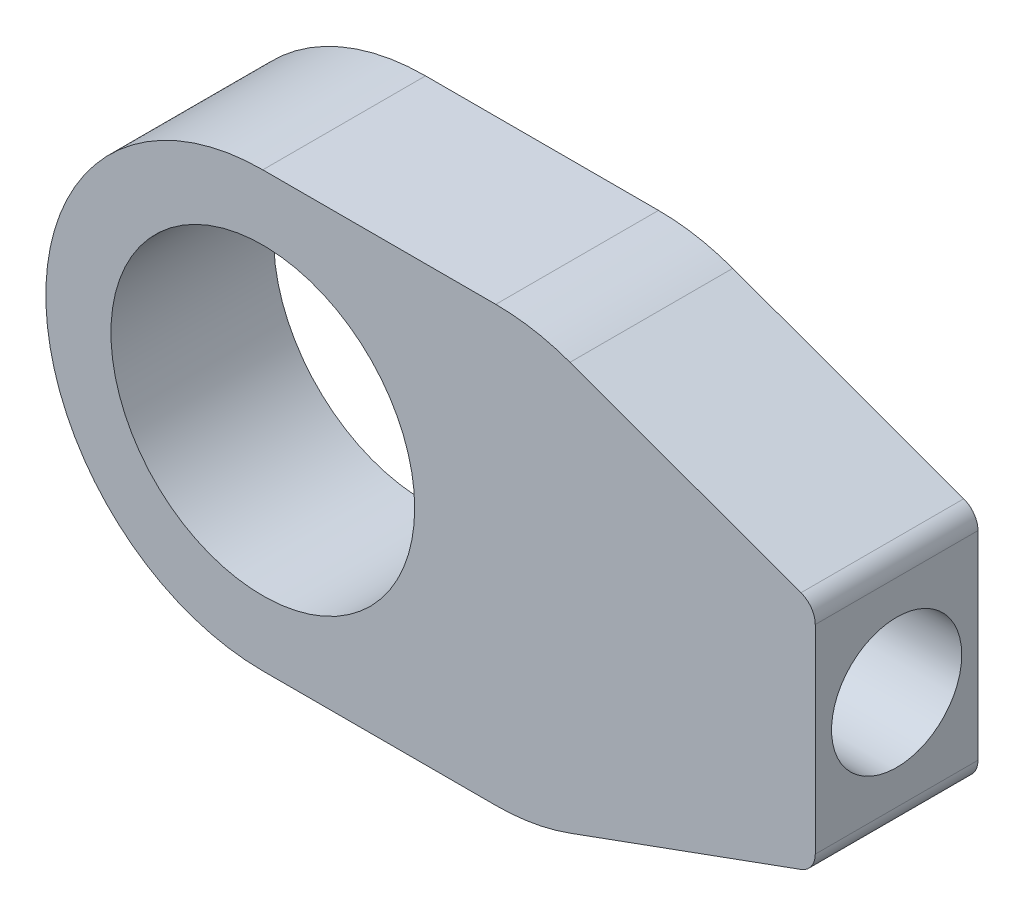
ISO-10303-21;
HEADER;
FILE_DESCRIPTION(('STEP AP214'),'2;1');
FILE_NAME('part.step','',(''),(''),'','','');
FILE_SCHEMA(('AUTOMOTIVE_DESIGN { 1 0 10303 214 1 1 1 1 }'));
ENDSEC;
DATA;
#1=APPLICATION_CONTEXT('core data for automotive mechanical design processes');
#2=APPLICATION_PROTOCOL_DEFINITION('international standard','automotive_design',2000,#1);
#3=PRODUCT_CONTEXT('',#1,'mechanical');
#4=PRODUCT('Part','Part','',(#3));
#5=PRODUCT_RELATED_PRODUCT_CATEGORY('part','',(#4));
#6=PRODUCT_DEFINITION_FORMATION('','',#4);
#7=PRODUCT_DEFINITION_CONTEXT('part definition',#1,'design');
#8=PRODUCT_DEFINITION('design','',#6,#7);
#9=PRODUCT_DEFINITION_SHAPE('','',#8);
#10=(LENGTH_UNIT() NAMED_UNIT(*) SI_UNIT(.MILLI.,.METRE.));
#11=(NAMED_UNIT(*) PLANE_ANGLE_UNIT() SI_UNIT($,.RADIAN.));
#12=(NAMED_UNIT(*) SI_UNIT($,.STERADIAN.) SOLID_ANGLE_UNIT());
#13=UNCERTAINTY_MEASURE_WITH_UNIT(LENGTH_MEASURE(1.E-05),#10,'distance_accuracy_value','');
#14=(GEOMETRIC_REPRESENTATION_CONTEXT(3) GLOBAL_UNCERTAINTY_ASSIGNED_CONTEXT((#13)) GLOBAL_UNIT_ASSIGNED_CONTEXT((#10,
#11,#12)) REPRESENTATION_CONTEXT('',''));
#15=CARTESIAN_POINT('',(0.,0.,0.));
#16=DIRECTION('',(0.,0.,1.));
#17=DIRECTION('',(1.,0.,0.));
#18=AXIS2_PLACEMENT_3D('',#15,#16,#17);
#19=CARTESIAN_POINT('',(24.4604511048396,-4.58257403696616,7.5));
#20=DIRECTION('',(0.,0.,1.));
#21=DIRECTION('',(1.,0.,0.));
#22=AXIS2_PLACEMENT_3D('',#19,#20,#21);
#23=PLANE('',#22);
#24=CARTESIAN_POINT('',(24.4604511048396,-4.58257403696616,7.5));
#25=DIRECTION('',(0.,0.,1.));
#26=DIRECTION('',(1.,0.,0.));
#27=AXIS2_PLACEMENT_3D('',#24,#25,#26);
#28=CIRCLE('',#27,1.);
#29=CARTESIAN_POINT('',(24.8024712481653,-5.52226665775207,7.5));
#30=VERTEX_POINT('',#29);
#31=CARTESIAN_POINT('',(25.4604511048396,-4.58257403696616,7.5));
#32=VERTEX_POINT('',#31);
#33=EDGE_CURVE('E166',#30,#32,#28,.T.);
#34=ORIENTED_EDGE('',*,*,#33,.T.);
#35=DIRECTION('',(0.,1.,0.));
#36=VECTOR('',#35,1.);
#37=CARTESIAN_POINT('',(25.4604511048396,-4.58257403696616,7.5));
#38=LINE('',#37,#36);
#39=CARTESIAN_POINT('',(25.4604511048396,4.58257403696615,7.5));
#40=VERTEX_POINT('',#39);
#41=EDGE_CURVE('E104',#32,#40,#38,.T.);
#42=ORIENTED_EDGE('',*,*,#41,.T.);
#43=CARTESIAN_POINT('',(24.4604511048396,4.58257403696615,7.5));
#44=DIRECTION('',(0.,0.,1.));
#45=DIRECTION('',(1.,0.,0.));
#46=AXIS2_PLACEMENT_3D('',#43,#44,#45);
#47=CIRCLE('',#46,1.);
#48=CARTESIAN_POINT('',(24.8024712481653,5.52226665775206,7.5));
#49=VERTEX_POINT('',#48);
#50=EDGE_CURVE('E187',#40,#49,#47,.T.);
#51=ORIENTED_EDGE('',*,*,#50,.T.);
#52=DIRECTION('',(-0.939692620785908,0.342020143325669,0.));
#53=VECTOR('',#52,1.);
#54=CARTESIAN_POINT('',(24.8024712481653,5.52226665775206,7.5));
#55=LINE('',#54,#53);
#56=CARTESIAN_POINT('',(14.156931626172,9.39692620785908,7.5));
#57=VERTEX_POINT('',#56);
#58=EDGE_CURVE('E206',#49,#57,#55,.T.);
#59=ORIENTED_EDGE('',*,*,#58,.T.);
#60=CARTESIAN_POINT('',(10.7367301929153,0.,7.5));
#61=DIRECTION('',(0.,0.,1.));
#62=DIRECTION('',(1.,0.,0.));
#63=AXIS2_PLACEMENT_3D('',#60,#61,#62);
#64=CIRCLE('',#63,10.);
#65=CARTESIAN_POINT('',(10.7367301929153,10.,7.5));
#66=VERTEX_POINT('',#65);
#67=EDGE_CURVE('E203',#57,#66,#64,.T.);
#68=ORIENTED_EDGE('',*,*,#67,.T.);
#69=DIRECTION('',(-1.,0.,0.));
#70=VECTOR('',#69,1.);
#71=CARTESIAN_POINT('',(10.7367301929153,10.,7.5));
#72=LINE('',#71,#70);
#73=CARTESIAN_POINT('',(0.,10.,7.5));
#74=VERTEX_POINT('',#73);
#75=EDGE_CURVE('E205',#66,#74,#72,.T.);
#76=ORIENTED_EDGE('',*,*,#75,.T.);
#77=CARTESIAN_POINT('',(0.,0.,7.5));
#78=DIRECTION('',(0.,0.,1.));
#79=DIRECTION('',(1.,0.,0.));
#80=AXIS2_PLACEMENT_3D('',#77,#78,#79);
#81=CIRCLE('',#80,10.);
#82=CARTESIAN_POINT('',(0.,-10.,7.5));
#83=VERTEX_POINT('',#82);
#84=EDGE_CURVE('E129',#74,#83,#81,.T.);
#85=ORIENTED_EDGE('',*,*,#84,.T.);
#86=DIRECTION('',(1.,0.,0.));
#87=VECTOR('',#86,1.);
#88=CARTESIAN_POINT('',(0.,-10.,7.5));
#89=LINE('',#88,#87);
#90=CARTESIAN_POINT('',(10.7367301929154,-9.99999999999999,7.5));
#91=VERTEX_POINT('',#90);
#92=EDGE_CURVE('E123',#83,#91,#89,.T.);
#93=ORIENTED_EDGE('',*,*,#92,.T.);
#94=CARTESIAN_POINT('',(10.7367301929154,0.,7.5));
#95=DIRECTION('',(0.,0.,1.));
#96=DIRECTION('',(1.,0.,0.));
#97=AXIS2_PLACEMENT_3D('',#94,#95,#96);
#98=CIRCLE('',#97,10.);
#99=CARTESIAN_POINT('',(14.1569316261721,-9.39692620785908,7.5));
#100=VERTEX_POINT('',#99);
#101=EDGE_CURVE('E127',#91,#100,#98,.T.);
#102=ORIENTED_EDGE('',*,*,#101,.T.);
#103=DIRECTION('',(0.939692620785908,0.342020143325669,0.));
#104=VECTOR('',#103,1.);
#105=CARTESIAN_POINT('',(14.1569316261721,-9.39692620785908,7.5));
#106=LINE('',#105,#104);
#107=EDGE_CURVE('E55',#100,#30,#106,.T.);
#108=ORIENTED_EDGE('',*,*,#107,.T.);
#109=EDGE_LOOP('',(#34,#42,#51,#59,#68,#76,#85,#93,#102,#108));
#110=FACE_BOUND('',#109,.T.);
#111=CARTESIAN_POINT('',(0.,0.,7.5));
#112=DIRECTION('',(0.,0.,1.));
#113=DIRECTION('',(1.,0.,0.));
#114=AXIS2_PLACEMENT_3D('',#111,#112,#113);
#115=CIRCLE('',#114,7.);
#116=CARTESIAN_POINT('',(7.,0.,7.5));
#117=VERTEX_POINT('',#116);
#118=EDGE_CURVE('E151',#117,#117,#115,.T.);
#119=ORIENTED_EDGE('',*,*,#118,.F.);
#120=EDGE_LOOP('',(#119));
#121=FACE_BOUND('',#120,.T.);
#122=ADVANCED_FACE('F38',(#110,#121),#23,.T.);
#123=CARTESIAN_POINT('',(24.4604511048396,-4.58257403696616,0.));
#124=DIRECTION('',(0.,0.,1.));
#125=DIRECTION('',(1.,0.,0.));
#126=AXIS2_PLACEMENT_3D('',#123,#124,#125);
#127=PLANE('',#126);
#128=CARTESIAN_POINT('',(24.4604511048396,-4.58257403696616,0.));
#129=DIRECTION('',(0.,0.,1.));
#130=DIRECTION('',(1.,0.,0.));
#131=AXIS2_PLACEMENT_3D('',#128,#129,#130);
#132=CIRCLE('',#131,1.);
#133=CARTESIAN_POINT('',(24.8024712481653,-5.52226665775207,0.));
#134=VERTEX_POINT('',#133);
#135=CARTESIAN_POINT('',(25.4604511048396,-4.58257403696616,0.));
#136=VERTEX_POINT('',#135);
#137=EDGE_CURVE('E147',#134,#136,#132,.T.);
#138=ORIENTED_EDGE('',*,*,#137,.F.);
#139=DIRECTION('',(0.939692620785908,0.342020143325669,0.));
#140=VECTOR('',#139,1.);
#141=CARTESIAN_POINT('',(14.1569316261721,-9.39692620785908,0.));
#142=LINE('',#141,#140);
#143=CARTESIAN_POINT('',(14.1569316261721,-9.39692620785908,0.));
#144=VERTEX_POINT('',#143);
#145=EDGE_CURVE('E96',#144,#134,#142,.T.);
#146=ORIENTED_EDGE('',*,*,#145,.F.);
#147=CARTESIAN_POINT('',(10.7367301929154,0.,0.));
#148=DIRECTION('',(0.,0.,1.));
#149=DIRECTION('',(1.,0.,0.));
#150=AXIS2_PLACEMENT_3D('',#147,#148,#149);
#151=CIRCLE('',#150,10.);
#152=CARTESIAN_POINT('',(10.7367301929154,-9.99999999999999,0.));
#153=VERTEX_POINT('',#152);
#154=EDGE_CURVE('E90',#153,#144,#151,.T.);
#155=ORIENTED_EDGE('',*,*,#154,.F.);
#156=DIRECTION('',(1.,0.,0.));
#157=VECTOR('',#156,1.);
#158=CARTESIAN_POINT('',(0.,-10.,0.));
#159=LINE('',#158,#157);
#160=CARTESIAN_POINT('',(0.,-10.,0.));
#161=VERTEX_POINT('',#160);
#162=EDGE_CURVE('E137',#161,#153,#159,.T.);
#163=ORIENTED_EDGE('',*,*,#162,.F.);
#164=CARTESIAN_POINT('',(0.,0.,0.));
#165=DIRECTION('',(0.,0.,1.));
#166=DIRECTION('',(1.,0.,0.));
#167=AXIS2_PLACEMENT_3D('',#164,#165,#166);
#168=CIRCLE('',#167,10.);
#169=CARTESIAN_POINT('',(0.,10.,0.));
#170=VERTEX_POINT('',#169);
#171=EDGE_CURVE('E161',#170,#161,#168,.T.);
#172=ORIENTED_EDGE('',*,*,#171,.F.);
#173=DIRECTION('',(-1.,0.,0.));
#174=VECTOR('',#173,1.);
#175=CARTESIAN_POINT('',(10.7367301929153,10.,0.));
#176=LINE('',#175,#174);
#177=CARTESIAN_POINT('',(10.7367301929153,10.,0.));
#178=VERTEX_POINT('',#177);
#179=EDGE_CURVE('E159',#178,#170,#176,.T.);
#180=ORIENTED_EDGE('',*,*,#179,.F.);
#181=CARTESIAN_POINT('',(10.7367301929153,0.,0.));
#182=DIRECTION('',(0.,0.,1.));
#183=DIRECTION('',(1.,0.,0.));
#184=AXIS2_PLACEMENT_3D('',#181,#182,#183);
#185=CIRCLE('',#184,10.);
#186=CARTESIAN_POINT('',(14.156931626172,9.39692620785908,0.));
#187=VERTEX_POINT('',#186);
#188=EDGE_CURVE('E157',#187,#178,#185,.T.);
#189=ORIENTED_EDGE('',*,*,#188,.F.);
#190=DIRECTION('',(-0.939692620785908,0.342020143325669,0.));
#191=VECTOR('',#190,1.);
#192=CARTESIAN_POINT('',(24.8024712481653,5.52226665775206,0.));
#193=LINE('',#192,#191);
#194=CARTESIAN_POINT('',(24.8024712481653,5.52226665775206,0.));
#195=VERTEX_POINT('',#194);
#196=EDGE_CURVE('E155',#195,#187,#193,.T.);
#197=ORIENTED_EDGE('',*,*,#196,.F.);
#198=CARTESIAN_POINT('',(24.4604511048396,4.58257403696615,0.));
#199=DIRECTION('',(0.,0.,1.));
#200=DIRECTION('',(1.,0.,0.));
#201=AXIS2_PLACEMENT_3D('',#198,#199,#200);
#202=CIRCLE('',#201,1.);
#203=CARTESIAN_POINT('',(25.4604511048396,4.58257403696615,0.));
#204=VERTEX_POINT('',#203);
#205=EDGE_CURVE('E153',#204,#195,#202,.T.);
#206=ORIENTED_EDGE('',*,*,#205,.F.);
#207=DIRECTION('',(0.,1.,0.));
#208=VECTOR('',#207,1.);
#209=CARTESIAN_POINT('',(25.4604511048396,-4.58257403696616,0.));
#210=LINE('',#209,#208);
#211=EDGE_CURVE('E150',#136,#204,#210,.T.);
#212=ORIENTED_EDGE('',*,*,#211,.F.);
#213=EDGE_LOOP('',(#138,#146,#155,#163,#172,#180,#189,#197,#206,#212));
#214=FACE_BOUND('',#213,.T.);
#215=CARTESIAN_POINT('',(0.,0.,0.));
#216=DIRECTION('',(0.,0.,1.));
#217=DIRECTION('',(1.,0.,0.));
#218=AXIS2_PLACEMENT_3D('',#215,#216,#217);
#219=CIRCLE('',#218,7.);
#220=CARTESIAN_POINT('',(7.,0.,0.));
#221=VERTEX_POINT('',#220);
#222=EDGE_CURVE('E214',#221,#221,#219,.T.);
#223=ORIENTED_EDGE('',*,*,#222,.T.);
#224=EDGE_LOOP('',(#223));
#225=FACE_BOUND('',#224,.T.);
#226=ADVANCED_FACE('F191',(#214,#225),#127,.F.);
#227=CARTESIAN_POINT('',(24.4604511048396,-4.58257403696616,7.5));
#228=DIRECTION('',(0.,0.,-1.));
#229=DIRECTION('',(-1.,0.,0.));
#230=AXIS2_PLACEMENT_3D('',#227,#228,#229);
#231=CYLINDRICAL_SURFACE('',#230,1.);
#232=ORIENTED_EDGE('',*,*,#137,.T.);
#233=DIRECTION('',(0.,0.,-1.));
#234=VECTOR('',#233,1.);
#235=CARTESIAN_POINT('',(25.4604511048396,-4.58257403696616,7.5));
#236=LINE('',#235,#234);
#237=EDGE_CURVE('E11',#32,#136,#236,.T.);
#238=ORIENTED_EDGE('',*,*,#237,.F.);
#239=ORIENTED_EDGE('',*,*,#33,.F.);
#240=DIRECTION('',(0.,0.,-1.));
#241=VECTOR('',#240,1.);
#242=CARTESIAN_POINT('',(24.8024712481653,-5.52226665775207,7.5));
#243=LINE('',#242,#241);
#244=EDGE_CURVE('E143',#30,#134,#243,.T.);
#245=ORIENTED_EDGE('',*,*,#244,.T.);
#246=EDGE_LOOP('',(#232,#238,#239,#245));
#247=FACE_BOUND('',#246,.T.);
#248=ADVANCED_FACE('F40',(#247),#231,.T.);
#249=CARTESIAN_POINT('',(25.4604511048396,-4.58257403696616,7.5));
#250=DIRECTION('',(-1.,0.,0.));
#251=DIRECTION('',(0.,0.,1.));
#252=AXIS2_PLACEMENT_3D('',#249,#250,#251);
#253=PLANE('',#252);
#254=CARTESIAN_POINT('',(25.4604511048396,0.,3.75));
#255=DIRECTION('',(1.,0.,0.));
#256=DIRECTION('',(0.,0.,-1.));
#257=AXIS2_PLACEMENT_3D('',#254,#255,#256);
#258=CIRCLE('',#257,3.);
#259=CARTESIAN_POINT('',(25.4604511048396,0.,0.749999999999999));
#260=VERTEX_POINT('',#259);
#261=EDGE_CURVE('E220',#260,#260,#258,.T.);
#262=ORIENTED_EDGE('',*,*,#261,.F.);
#263=EDGE_LOOP('',(#262));
#264=FACE_BOUND('',#263,.T.);
#265=ORIENTED_EDGE('',*,*,#211,.T.);
#266=DIRECTION('',(0.,0.,-1.));
#267=VECTOR('',#266,1.);
#268=CARTESIAN_POINT('',(25.4604511048396,4.58257403696615,7.5));
#269=LINE('',#268,#267);
#270=EDGE_CURVE('E47',#40,#204,#269,.T.);
#271=ORIENTED_EDGE('',*,*,#270,.F.);
#272=ORIENTED_EDGE('',*,*,#41,.F.);
#273=ORIENTED_EDGE('',*,*,#237,.T.);
#274=EDGE_LOOP('',(#265,#271,#272,#273));
#275=FACE_BOUND('',#274,.T.);
#276=ADVANCED_FACE('F235',(#264,#275),#253,.F.);
#277=CARTESIAN_POINT('',(24.4604511048396,4.58257403696615,7.5));
#278=DIRECTION('',(0.,0.,-1.));
#279=DIRECTION('',(-1.,0.,0.));
#280=AXIS2_PLACEMENT_3D('',#277,#278,#279);
#281=CYLINDRICAL_SURFACE('',#280,1.);
#282=ORIENTED_EDGE('',*,*,#205,.T.);
#283=DIRECTION('',(0.,0.,-1.));
#284=VECTOR('',#283,1.);
#285=CARTESIAN_POINT('',(24.8024712481653,5.52226665775206,7.5));
#286=LINE('',#285,#284);
#287=EDGE_CURVE('E179',#49,#195,#286,.T.);
#288=ORIENTED_EDGE('',*,*,#287,.F.);
#289=ORIENTED_EDGE('',*,*,#50,.F.);
#290=ORIENTED_EDGE('',*,*,#270,.T.);
#291=EDGE_LOOP('',(#282,#288,#289,#290));
#292=FACE_BOUND('',#291,.T.);
#293=ADVANCED_FACE('F185',(#292),#281,.T.);
#294=CARTESIAN_POINT('',(24.8024712481653,5.52226665775206,7.5));
#295=DIRECTION('',(-0.34202014332567,-0.939692620785908,0.));
#296=DIRECTION('',(0.939692620785908,-0.34202014332567,0.));
#297=AXIS2_PLACEMENT_3D('',#294,#295,#296);
#298=PLANE('',#297);
#299=ORIENTED_EDGE('',*,*,#196,.T.);
#300=DIRECTION('',(0.,0.,-1.));
#301=VECTOR('',#300,1.);
#302=CARTESIAN_POINT('',(14.156931626172,9.39692620785908,7.5));
#303=LINE('',#302,#301);
#304=EDGE_CURVE('E176',#57,#187,#303,.T.);
#305=ORIENTED_EDGE('',*,*,#304,.F.);
#306=ORIENTED_EDGE('',*,*,#58,.F.);
#307=ORIENTED_EDGE('',*,*,#287,.T.);
#308=EDGE_LOOP('',(#299,#305,#306,#307));
#309=FACE_BOUND('',#308,.T.);
#310=ADVANCED_FACE('F197',(#309),#298,.F.);
#311=CARTESIAN_POINT('',(10.7367301929153,0.,7.5));
#312=DIRECTION('',(0.,0.,-1.));
#313=DIRECTION('',(-1.,0.,0.));
#314=AXIS2_PLACEMENT_3D('',#311,#312,#313);
#315=CYLINDRICAL_SURFACE('',#314,10.);
#316=ORIENTED_EDGE('',*,*,#188,.T.);
#317=DIRECTION('',(0.,0.,-1.));
#318=VECTOR('',#317,1.);
#319=CARTESIAN_POINT('',(10.7367301929153,10.,7.5));
#320=LINE('',#319,#318);
#321=EDGE_CURVE('E173',#66,#178,#320,.T.);
#322=ORIENTED_EDGE('',*,*,#321,.F.);
#323=ORIENTED_EDGE('',*,*,#67,.F.);
#324=ORIENTED_EDGE('',*,*,#304,.T.);
#325=EDGE_LOOP('',(#316,#322,#323,#324));
#326=FACE_BOUND('',#325,.T.);
#327=ADVANCED_FACE('F201',(#326),#315,.T.);
#328=CARTESIAN_POINT('',(10.7367301929153,10.,7.5));
#329=DIRECTION('',(0.,-1.,0.));
#330=DIRECTION('',(0.,0.,-1.));
#331=AXIS2_PLACEMENT_3D('',#328,#329,#330);
#332=PLANE('',#331);
#333=ORIENTED_EDGE('',*,*,#179,.T.);
#334=DIRECTION('',(0.,0.,-1.));
#335=VECTOR('',#334,1.);
#336=CARTESIAN_POINT('',(0.,10.,7.5));
#337=LINE('',#336,#335);
#338=EDGE_CURVE('E170',#74,#170,#337,.T.);
#339=ORIENTED_EDGE('',*,*,#338,.F.);
#340=ORIENTED_EDGE('',*,*,#75,.F.);
#341=ORIENTED_EDGE('',*,*,#321,.T.);
#342=EDGE_LOOP('',(#333,#339,#340,#341));
#343=FACE_BOUND('',#342,.T.);
#344=ADVANCED_FACE('F245',(#343),#332,.F.);
#345=CARTESIAN_POINT('',(0.,0.,7.5));
#346=DIRECTION('',(0.,0.,-1.));
#347=DIRECTION('',(-1.,0.,0.));
#348=AXIS2_PLACEMENT_3D('',#345,#346,#347);
#349=CYLINDRICAL_SURFACE('',#348,10.);
#350=ORIENTED_EDGE('',*,*,#171,.T.);
#351=DIRECTION('',(0.,0.,-1.));
#352=VECTOR('',#351,1.);
#353=CARTESIAN_POINT('',(0.,-10.,7.5));
#354=LINE('',#353,#352);
#355=EDGE_CURVE('E138',#83,#161,#354,.T.);
#356=ORIENTED_EDGE('',*,*,#355,.F.);
#357=ORIENTED_EDGE('',*,*,#84,.F.);
#358=ORIENTED_EDGE('',*,*,#338,.T.);
#359=EDGE_LOOP('',(#350,#356,#357,#358));
#360=FACE_BOUND('',#359,.T.);
#361=ADVANCED_FACE('F242',(#360),#349,.T.);
#362=CARTESIAN_POINT('',(0.,-10.,7.5));
#363=DIRECTION('',(0.,1.,0.));
#364=DIRECTION('',(-1.,0.,0.));
#365=AXIS2_PLACEMENT_3D('',#362,#363,#364);
#366=PLANE('',#365);
#367=ORIENTED_EDGE('',*,*,#162,.T.);
#368=DIRECTION('',(0.,0.,-1.));
#369=VECTOR('',#368,1.);
#370=CARTESIAN_POINT('',(10.7367301929154,-9.99999999999999,7.5));
#371=LINE('',#370,#369);
#372=EDGE_CURVE('E134',#91,#153,#371,.T.);
#373=ORIENTED_EDGE('',*,*,#372,.F.);
#374=ORIENTED_EDGE('',*,*,#92,.F.);
#375=ORIENTED_EDGE('',*,*,#355,.T.);
#376=EDGE_LOOP('',(#367,#373,#374,#375));
#377=FACE_BOUND('',#376,.T.);
#378=ADVANCED_FACE('F135',(#377),#366,.F.);
#379=CARTESIAN_POINT('',(10.7367301929154,0.,7.5));
#380=DIRECTION('',(0.,0.,-1.));
#381=DIRECTION('',(-1.,0.,0.));
#382=AXIS2_PLACEMENT_3D('',#379,#380,#381);
#383=CYLINDRICAL_SURFACE('',#382,10.);
#384=ORIENTED_EDGE('',*,*,#154,.T.);
#385=DIRECTION('',(0.,0.,-1.));
#386=VECTOR('',#385,1.);
#387=CARTESIAN_POINT('',(14.1569316261721,-9.39692620785908,7.5));
#388=LINE('',#387,#386);
#389=EDGE_CURVE('E139',#100,#144,#388,.T.);
#390=ORIENTED_EDGE('',*,*,#389,.F.);
#391=ORIENTED_EDGE('',*,*,#101,.F.);
#392=ORIENTED_EDGE('',*,*,#372,.T.);
#393=EDGE_LOOP('',(#384,#390,#391,#392));
#394=FACE_BOUND('',#393,.T.);
#395=ADVANCED_FACE('F141',(#394),#383,.T.);
#396=CARTESIAN_POINT('',(14.1569316261721,-9.39692620785908,7.5));
#397=DIRECTION('',(-0.342020143325669,0.939692620785908,0.));
#398=DIRECTION('',(-0.939692620785909,-0.342020143325669,0.));
#399=AXIS2_PLACEMENT_3D('',#396,#397,#398);
#400=PLANE('',#399);
#401=ORIENTED_EDGE('',*,*,#145,.T.);
#402=ORIENTED_EDGE('',*,*,#244,.F.);
#403=ORIENTED_EDGE('',*,*,#107,.F.);
#404=ORIENTED_EDGE('',*,*,#389,.T.);
#405=EDGE_LOOP('',(#401,#402,#403,#404));
#406=FACE_BOUND('',#405,.T.);
#407=ADVANCED_FACE('F262',(#406),#400,.F.);
#408=CARTESIAN_POINT('',(0.,0.,7.5));
#409=DIRECTION('',(0.,0.,-1.));
#410=DIRECTION('',(-1.,0.,0.));
#411=AXIS2_PLACEMENT_3D('',#408,#409,#410);
#412=CYLINDRICAL_SURFACE('',#411,7.);
#413=ORIENTED_EDGE('',*,*,#118,.T.);
#414=EDGE_LOOP('',(#413));
#415=FACE_BOUND('',#414,.T.);
#416=ORIENTED_EDGE('',*,*,#222,.F.);
#417=EDGE_LOOP('',(#416));
#418=FACE_BOUND('',#417,.T.);
#419=ADVANCED_FACE('F231',(#415,#418),#412,.F.);
#420=CARTESIAN_POINT('',(15.4604511048396,0.,3.75));
#421=DIRECTION('',(1.,0.,0.));
#422=DIRECTION('',(0.,0.,-1.));
#423=AXIS2_PLACEMENT_3D('',#420,#421,#422);
#424=CYLINDRICAL_SURFACE('',#423,3.);
#425=CARTESIAN_POINT('',(15.4604511048396,0.,3.75));
#426=DIRECTION('',(1.,0.,0.));
#427=DIRECTION('',(0.,0.,-1.));
#428=AXIS2_PLACEMENT_3D('',#425,#426,#427);
#429=CIRCLE('',#428,3.);
#430=CARTESIAN_POINT('',(15.4604511048396,0.,0.749999999999999));
#431=VERTEX_POINT('',#430);
#432=EDGE_CURVE('E217',#431,#431,#429,.T.);
#433=ORIENTED_EDGE('',*,*,#432,.F.);
#434=EDGE_LOOP('',(#433));
#435=FACE_BOUND('',#434,.T.);
#436=ORIENTED_EDGE('',*,*,#261,.T.);
#437=EDGE_LOOP('',(#436));
#438=FACE_BOUND('',#437,.T.);
#439=ADVANCED_FACE('F228',(#435,#438),#424,.F.);
#440=CARTESIAN_POINT('',(15.4604511048396,0.,3.75));
#441=DIRECTION('',(1.,0.,0.));
#442=DIRECTION('',(0.,0.,-1.));
#443=AXIS2_PLACEMENT_3D('',#440,#441,#442);
#444=PLANE('',#443);
#445=ORIENTED_EDGE('',*,*,#432,.T.);
#446=EDGE_LOOP('',(#445));
#447=FACE_BOUND('',#446,.T.);
#448=ADVANCED_FACE('F226',(#447),#444,.T.);
#449=CLOSED_SHELL('',(#122,#226,#248,#276,#293,#310,#327,#344,#361,#378,#395,#407,#419,#439,#448));
#450=MANIFOLD_SOLID_BREP('B2',#449);
#451=ADVANCED_BREP_SHAPE_REPRESENTATION('',(#18,#450),#14);
#452=SHAPE_DEFINITION_REPRESENTATION(#9,#451);
ENDSEC;
END-ISO-10303-21;
